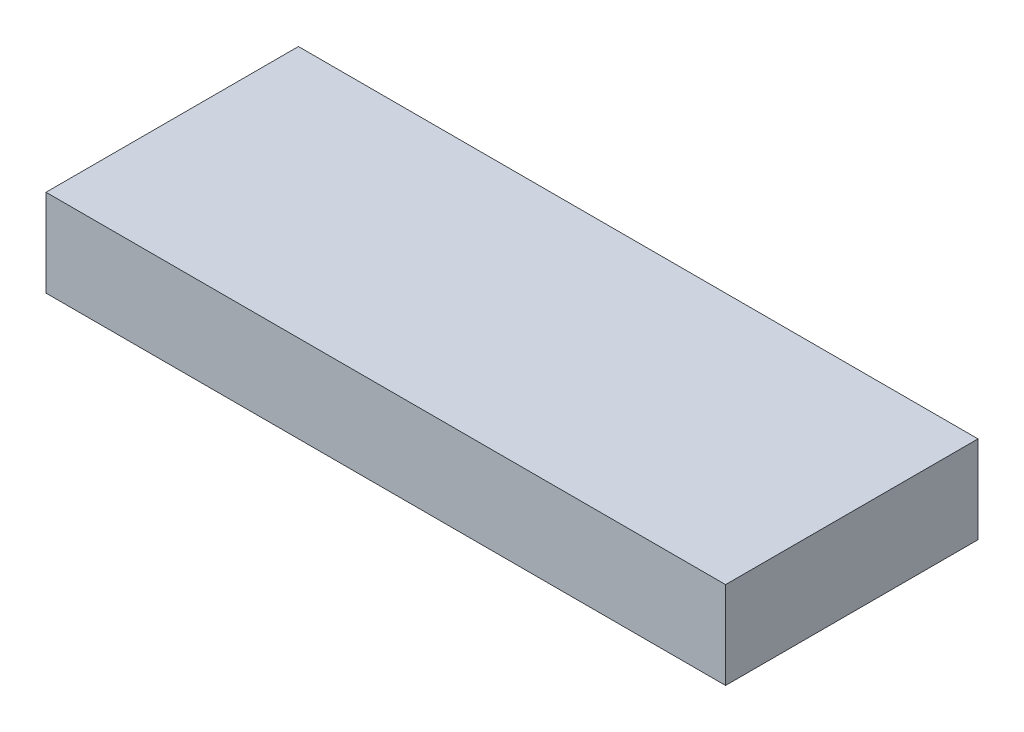
ISO-10303-21;
HEADER;
FILE_DESCRIPTION(('STEP AP214'),'2;1');
FILE_NAME('part.step','',(''),(''),'','','');
FILE_SCHEMA(('AUTOMOTIVE_DESIGN { 1 0 10303 214 1 1 1 1 }'));
ENDSEC;
DATA;
#1=APPLICATION_CONTEXT('core data for automotive mechanical design processes');
#2=APPLICATION_PROTOCOL_DEFINITION('international standard','automotive_design',2000,#1);
#3=PRODUCT_CONTEXT('',#1,'mechanical');
#4=PRODUCT('Part','Part','',(#3));
#5=PRODUCT_RELATED_PRODUCT_CATEGORY('part','',(#4));
#6=PRODUCT_DEFINITION_FORMATION('','',#4);
#7=PRODUCT_DEFINITION_CONTEXT('part definition',#1,'design');
#8=PRODUCT_DEFINITION('design','',#6,#7);
#9=PRODUCT_DEFINITION_SHAPE('','',#8);
#10=(LENGTH_UNIT() NAMED_UNIT(*) SI_UNIT(.MILLI.,.METRE.));
#11=(NAMED_UNIT(*) PLANE_ANGLE_UNIT() SI_UNIT($,.RADIAN.));
#12=(NAMED_UNIT(*) SI_UNIT($,.STERADIAN.) SOLID_ANGLE_UNIT());
#13=UNCERTAINTY_MEASURE_WITH_UNIT(LENGTH_MEASURE(1.E-05),#10,'distance_accuracy_value','');
#14=(GEOMETRIC_REPRESENTATION_CONTEXT(3) GLOBAL_UNCERTAINTY_ASSIGNED_CONTEXT((#13)) GLOBAL_UNIT_ASSIGNED_CONTEXT((#10,
#11,#12)) REPRESENTATION_CONTEXT('',''));
#15=CARTESIAN_POINT('',(0.,0.,0.));
#16=DIRECTION('',(0.,0.,1.));
#17=DIRECTION('',(1.,0.,0.));
#18=AXIS2_PLACEMENT_3D('',#15,#16,#17);
#19=CARTESIAN_POINT('',(70.,9.,-26.));
#20=DIRECTION('',(-1.,0.,0.));
#21=DIRECTION('',(0.,0.,1.));
#22=AXIS2_PLACEMENT_3D('',#19,#20,#21);
#23=PLANE('',#22);
#24=DIRECTION('',(0.,0.,-1.));
#25=VECTOR('',#24,1.);
#26=CARTESIAN_POINT('',(70.,-9.,-26.));
#27=LINE('',#26,#25);
#28=CARTESIAN_POINT('',(70.,-9.,26.));
#29=VERTEX_POINT('',#28);
#30=CARTESIAN_POINT('',(70.,-9.,-26.));
#31=VERTEX_POINT('',#30);
#32=EDGE_CURVE('E104',#29,#31,#27,.T.);
#33=ORIENTED_EDGE('',*,*,#32,.T.);
#34=DIRECTION('',(0.,-1.,0.));
#35=VECTOR('',#34,1.);
#36=CARTESIAN_POINT('',(70.,9.,-26.));
#37=LINE('',#36,#35);
#38=CARTESIAN_POINT('',(70.,9.,-26.));
#39=VERTEX_POINT('',#38);
#40=EDGE_CURVE('E11',#39,#31,#37,.T.);
#41=ORIENTED_EDGE('',*,*,#40,.F.);
#42=DIRECTION('',(0.,0.,-1.));
#43=VECTOR('',#42,1.);
#44=CARTESIAN_POINT('',(70.,9.,-26.));
#45=LINE('',#44,#43);
#46=CARTESIAN_POINT('',(70.,9.,26.));
#47=VERTEX_POINT('',#46);
#48=EDGE_CURVE('E92',#47,#39,#45,.T.);
#49=ORIENTED_EDGE('',*,*,#48,.F.);
#50=DIRECTION('',(0.,-1.,0.));
#51=VECTOR('',#50,1.);
#52=CARTESIAN_POINT('',(70.,9.,26.));
#53=LINE('',#52,#51);
#54=EDGE_CURVE('E100',#47,#29,#53,.T.);
#55=ORIENTED_EDGE('',*,*,#54,.T.);
#56=EDGE_LOOP('',(#33,#41,#49,#55));
#57=FACE_BOUND('',#56,.T.);
#58=ADVANCED_FACE('F41',(#57),#23,.F.);
#59=CARTESIAN_POINT('',(-70.,9.,-26.));
#60=DIRECTION('',(0.,0.,1.));
#61=DIRECTION('',(1.,0.,0.));
#62=AXIS2_PLACEMENT_3D('',#59,#60,#61);
#63=PLANE('',#62);
#64=DIRECTION('',(-1.,0.,0.));
#65=VECTOR('',#64,1.);
#66=CARTESIAN_POINT('',(-70.,-9.,-26.));
#67=LINE('',#66,#65);
#68=CARTESIAN_POINT('',(-70.,-9.,-26.));
#69=VERTEX_POINT('',#68);
#70=EDGE_CURVE('E96',#31,#69,#67,.T.);
#71=ORIENTED_EDGE('',*,*,#70,.T.);
#72=DIRECTION('',(0.,-1.,0.));
#73=VECTOR('',#72,1.);
#74=CARTESIAN_POINT('',(-70.,9.,-26.));
#75=LINE('',#74,#73);
#76=CARTESIAN_POINT('',(-70.,9.,-26.));
#77=VERTEX_POINT('',#76);
#78=EDGE_CURVE('E49',#77,#69,#75,.T.);
#79=ORIENTED_EDGE('',*,*,#78,.F.);
#80=DIRECTION('',(-1.,0.,0.));
#81=VECTOR('',#80,1.);
#82=CARTESIAN_POINT('',(-70.,9.,-26.));
#83=LINE('',#82,#81);
#84=EDGE_CURVE('E87',#39,#77,#83,.T.);
#85=ORIENTED_EDGE('',*,*,#84,.F.);
#86=ORIENTED_EDGE('',*,*,#40,.T.);
#87=EDGE_LOOP('',(#71,#79,#85,#86));
#88=FACE_BOUND('',#87,.T.);
#89=ADVANCED_FACE('F95',(#88),#63,.F.);
#90=CARTESIAN_POINT('',(-70.,9.,-26.));
#91=DIRECTION('',(1.,0.,0.));
#92=DIRECTION('',(0.,0.,-1.));
#93=AXIS2_PLACEMENT_3D('',#90,#91,#92);
#94=PLANE('',#93);
#95=DIRECTION('',(0.,0.,1.));
#96=VECTOR('',#95,1.);
#97=CARTESIAN_POINT('',(-70.,-9.,-26.));
#98=LINE('',#97,#96);
#99=CARTESIAN_POINT('',(-70.,-9.,26.));
#100=VERTEX_POINT('',#99);
#101=EDGE_CURVE('E74',#69,#100,#98,.T.);
#102=ORIENTED_EDGE('',*,*,#101,.T.);
#103=DIRECTION('',(0.,-1.,0.));
#104=VECTOR('',#103,1.);
#105=CARTESIAN_POINT('',(-70.,9.,26.));
#106=LINE('',#105,#104);
#107=CARTESIAN_POINT('',(-70.,9.,26.));
#108=VERTEX_POINT('',#107);
#109=EDGE_CURVE('E97',#108,#100,#106,.T.);
#110=ORIENTED_EDGE('',*,*,#109,.F.);
#111=DIRECTION('',(0.,0.,1.));
#112=VECTOR('',#111,1.);
#113=CARTESIAN_POINT('',(-70.,9.,-26.));
#114=LINE('',#113,#112);
#115=EDGE_CURVE('E90',#77,#108,#114,.T.);
#116=ORIENTED_EDGE('',*,*,#115,.F.);
#117=ORIENTED_EDGE('',*,*,#78,.T.);
#118=EDGE_LOOP('',(#102,#110,#116,#117));
#119=FACE_BOUND('',#118,.T.);
#120=ADVANCED_FACE('F98',(#119),#94,.F.);
#121=CARTESIAN_POINT('',(-70.,9.,26.));
#122=DIRECTION('',(0.,0.,-1.));
#123=DIRECTION('',(-1.,0.,0.));
#124=AXIS2_PLACEMENT_3D('',#121,#122,#123);
#125=PLANE('',#124);
#126=DIRECTION('',(1.,0.,0.));
#127=VECTOR('',#126,1.);
#128=CARTESIAN_POINT('',(-70.,-9.,26.));
#129=LINE('',#128,#127);
#130=EDGE_CURVE('E80',#100,#29,#129,.T.);
#131=ORIENTED_EDGE('',*,*,#130,.T.);
#132=ORIENTED_EDGE('',*,*,#54,.F.);
#133=DIRECTION('',(1.,0.,0.));
#134=VECTOR('',#133,1.);
#135=CARTESIAN_POINT('',(-70.,9.,26.));
#136=LINE('',#135,#134);
#137=EDGE_CURVE('E57',#108,#47,#136,.T.);
#138=ORIENTED_EDGE('',*,*,#137,.F.);
#139=ORIENTED_EDGE('',*,*,#109,.T.);
#140=EDGE_LOOP('',(#131,#132,#138,#139));
#141=FACE_BOUND('',#140,.T.);
#142=ADVANCED_FACE('F111',(#141),#125,.F.);
#143=CARTESIAN_POINT('',(0.,9.,0.));
#144=DIRECTION('',(0.,1.,0.));
#145=DIRECTION('',(0.,0.,1.));
#146=AXIS2_PLACEMENT_3D('',#143,#144,#145);
#147=PLANE('',#146);
#148=ORIENTED_EDGE('',*,*,#48,.T.);
#149=ORIENTED_EDGE('',*,*,#84,.T.);
#150=ORIENTED_EDGE('',*,*,#115,.T.);
#151=ORIENTED_EDGE('',*,*,#137,.T.);
#152=EDGE_LOOP('',(#148,#149,#150,#151));
#153=FACE_BOUND('',#152,.T.);
#154=ADVANCED_FACE('F88',(#153),#147,.T.);
#155=CARTESIAN_POINT('',(0.,-9.,0.));
#156=DIRECTION('',(0.,1.,0.));
#157=DIRECTION('',(0.,0.,1.));
#158=AXIS2_PLACEMENT_3D('',#155,#156,#157);
#159=PLANE('',#158);
#160=ORIENTED_EDGE('',*,*,#32,.F.);
#161=ORIENTED_EDGE('',*,*,#130,.F.);
#162=ORIENTED_EDGE('',*,*,#101,.F.);
#163=ORIENTED_EDGE('',*,*,#70,.F.);
#164=EDGE_LOOP('',(#160,#161,#162,#163));
#165=FACE_BOUND('',#164,.T.);
#166=ADVANCED_FACE('F114',(#165),#159,.F.);
#167=CLOSED_SHELL('',(#58,#89,#120,#142,#154,#166));
#168=MANIFOLD_SOLID_BREP('B2',#167);
#169=ADVANCED_BREP_SHAPE_REPRESENTATION('',(#18,#168),#14);
#170=SHAPE_DEFINITION_REPRESENTATION(#9,#169);
ENDSEC;
END-ISO-10303-21;
